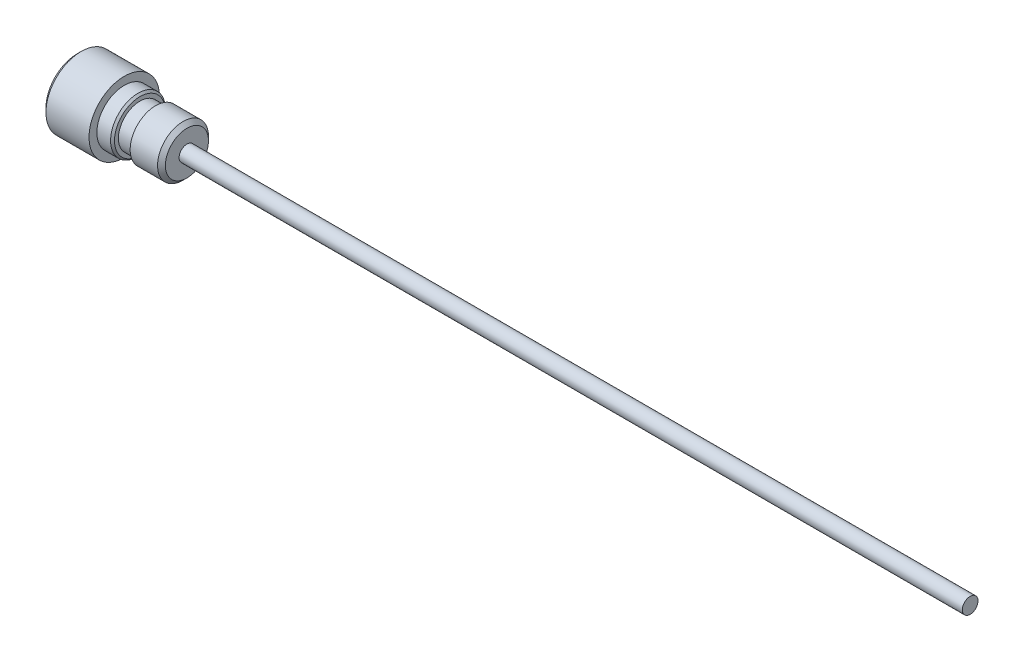
ISO-10303-21;
HEADER;
FILE_DESCRIPTION(('STEP AP214'),'2;1');
FILE_NAME('part.step','',(''),(''),'','','');
FILE_SCHEMA(('AUTOMOTIVE_DESIGN { 1 0 10303 214 1 1 1 1 }'));
ENDSEC;
DATA;
#1=APPLICATION_CONTEXT('core data for automotive mechanical design processes');
#2=APPLICATION_PROTOCOL_DEFINITION('international standard','automotive_design',2000,#1);
#3=PRODUCT_CONTEXT('',#1,'mechanical');
#4=PRODUCT('Part','Part','',(#3));
#5=PRODUCT_RELATED_PRODUCT_CATEGORY('part','',(#4));
#6=PRODUCT_DEFINITION_FORMATION('','',#4);
#7=PRODUCT_DEFINITION_CONTEXT('part definition',#1,'design');
#8=PRODUCT_DEFINITION('design','',#6,#7);
#9=PRODUCT_DEFINITION_SHAPE('','',#8);
#10=(LENGTH_UNIT() NAMED_UNIT(*) SI_UNIT(.MILLI.,.METRE.));
#11=(NAMED_UNIT(*) PLANE_ANGLE_UNIT() SI_UNIT($,.RADIAN.));
#12=(NAMED_UNIT(*) SI_UNIT($,.STERADIAN.) SOLID_ANGLE_UNIT());
#13=UNCERTAINTY_MEASURE_WITH_UNIT(LENGTH_MEASURE(1.E-05),#10,'distance_accuracy_value','');
#14=(GEOMETRIC_REPRESENTATION_CONTEXT(3) GLOBAL_UNCERTAINTY_ASSIGNED_CONTEXT((#13)) GLOBAL_UNIT_ASSIGNED_CONTEXT((#10,
#11,#12)) REPRESENTATION_CONTEXT('',''));
#15=CARTESIAN_POINT('',(0.,0.,0.));
#16=DIRECTION('',(0.,0.,1.));
#17=DIRECTION('',(1.,0.,0.));
#18=AXIS2_PLACEMENT_3D('',#15,#16,#17);
#19=CARTESIAN_POINT('',(12.,0.,0.));
#20=DIRECTION('',(-1.,0.,0.));
#21=DIRECTION('',(0.,0.,1.));
#22=AXIS2_PLACEMENT_3D('',#19,#20,#21);
#23=CYLINDRICAL_SURFACE('',#22,9.);
#24=CARTESIAN_POINT('',(1.,0.,0.));
#25=DIRECTION('',(1.,0.,0.));
#26=DIRECTION('',(0.,0.,-1.));
#27=AXIS2_PLACEMENT_3D('',#24,#25,#26);
#28=CIRCLE('',#27,9.);
#29=CARTESIAN_POINT('',(1.,0.,-9.));
#30=VERTEX_POINT('',#29);
#31=EDGE_CURVE('E58',#30,#30,#28,.T.);
#32=ORIENTED_EDGE('',*,*,#31,.T.);
#33=EDGE_LOOP('',(#32));
#34=FACE_BOUND('',#33,.T.);
#35=CARTESIAN_POINT('',(12.,0.,0.));
#36=DIRECTION('',(1.,0.,0.));
#37=DIRECTION('',(0.,0.,-1.));
#38=AXIS2_PLACEMENT_3D('',#35,#36,#37);
#39=CIRCLE('',#38,9.);
#40=CARTESIAN_POINT('',(12.,0.,-9.));
#41=VERTEX_POINT('',#40);
#42=EDGE_CURVE('E61',#41,#41,#39,.T.);
#43=ORIENTED_EDGE('',*,*,#42,.F.);
#44=EDGE_LOOP('',(#43));
#45=FACE_BOUND('',#44,.T.);
#46=ADVANCED_FACE('F30',(#34,#45),#23,.T.);
#47=CARTESIAN_POINT('',(12.,0.,0.));
#48=DIRECTION('',(1.,0.,0.));
#49=DIRECTION('',(0.,0.,-1.));
#50=AXIS2_PLACEMENT_3D('',#47,#48,#49);
#51=PLANE('',#50);
#52=CARTESIAN_POINT('',(12.,0.,0.));
#53=DIRECTION('',(1.,0.,0.));
#54=DIRECTION('',(0.,0.,-1.));
#55=AXIS2_PLACEMENT_3D('',#52,#53,#54);
#56=CIRCLE('',#55,7.);
#57=CARTESIAN_POINT('',(12.,0.,-7.));
#58=VERTEX_POINT('',#57);
#59=EDGE_CURVE('E57',#58,#58,#56,.T.);
#60=ORIENTED_EDGE('',*,*,#59,.F.);
#61=EDGE_LOOP('',(#60));
#62=FACE_BOUND('',#61,.T.);
#63=ORIENTED_EDGE('',*,*,#42,.T.);
#64=EDGE_LOOP('',(#63));
#65=FACE_BOUND('',#64,.T.);
#66=ADVANCED_FACE('F105',(#62,#65),#51,.T.);
#67=CARTESIAN_POINT('',(0.,0.,0.));
#68=DIRECTION('',(1.,0.,0.));
#69=DIRECTION('',(0.,0.,-1.));
#70=AXIS2_PLACEMENT_3D('',#67,#68,#69);
#71=PLANE('',#70);
#72=CARTESIAN_POINT('',(0.,0.,0.));
#73=DIRECTION('',(1.,0.,0.));
#74=DIRECTION('',(0.,0.,-1.));
#75=AXIS2_PLACEMENT_3D('',#72,#73,#74);
#76=CIRCLE('',#75,7.99999999999999);
#77=CARTESIAN_POINT('',(0.,0.,-7.99999999999999));
#78=VERTEX_POINT('',#77);
#79=EDGE_CURVE('E54',#78,#78,#76,.F.);
#80=ORIENTED_EDGE('',*,*,#79,.T.);
#81=EDGE_LOOP('',(#80));
#82=FACE_BOUND('',#81,.T.);
#83=ADVANCED_FACE('F111',(#82),#71,.F.);
#84=CARTESIAN_POINT('',(1.,0.,0.));
#85=DIRECTION('',(1.,0.,0.));
#86=DIRECTION('',(0.,0.,-1.));
#87=AXIS2_PLACEMENT_3D('',#84,#85,#86);
#88=CONICAL_SURFACE('',#87,9.,0.78539816339745);
#89=ORIENTED_EDGE('',*,*,#79,.F.);
#90=EDGE_LOOP('',(#89));
#91=FACE_BOUND('',#90,.T.);
#92=ORIENTED_EDGE('',*,*,#31,.F.);
#93=EDGE_LOOP('',(#92));
#94=FACE_BOUND('',#93,.T.);
#95=ADVANCED_FACE('F116',(#91,#94),#88,.T.);
#96=CARTESIAN_POINT('',(16.,0.,0.));
#97=DIRECTION('',(-1.,0.,0.));
#98=DIRECTION('',(0.,0.,1.));
#99=AXIS2_PLACEMENT_3D('',#96,#97,#98);
#100=CYLINDRICAL_SURFACE('',#99,7.);
#101=CARTESIAN_POINT('',(15.5,0.,0.));
#102=DIRECTION('',(1.,0.,0.));
#103=DIRECTION('',(0.,0.,-1.));
#104=AXIS2_PLACEMENT_3D('',#101,#102,#103);
#105=CIRCLE('',#104,7.);
#106=CARTESIAN_POINT('',(15.5,0.,-7.));
#107=VERTEX_POINT('',#106);
#108=EDGE_CURVE('E10',#107,#107,#105,.F.);
#109=ORIENTED_EDGE('',*,*,#108,.T.);
#110=EDGE_LOOP('',(#109));
#111=FACE_BOUND('',#110,.T.);
#112=ORIENTED_EDGE('',*,*,#59,.T.);
#113=EDGE_LOOP('',(#112));
#114=FACE_BOUND('',#113,.T.);
#115=ADVANCED_FACE('F118',(#111,#114),#100,.T.);
#116=CARTESIAN_POINT('',(16.,0.,0.));
#117=DIRECTION('',(1.,0.,0.));
#118=DIRECTION('',(0.,0.,-1.));
#119=AXIS2_PLACEMENT_3D('',#116,#117,#118);
#120=PLANE('',#119);
#121=CARTESIAN_POINT('',(16.,0.,0.));
#122=DIRECTION('',(1.,0.,0.));
#123=DIRECTION('',(0.,0.,-1.));
#124=AXIS2_PLACEMENT_3D('',#121,#122,#123);
#125=CIRCLE('',#124,6.49999999999998);
#126=CARTESIAN_POINT('',(16.,0.,-6.49999999999998));
#127=VERTEX_POINT('',#126);
#128=EDGE_CURVE('E37',#127,#127,#125,.T.);
#129=ORIENTED_EDGE('',*,*,#128,.T.);
#130=EDGE_LOOP('',(#129));
#131=FACE_BOUND('',#130,.T.);
#132=CARTESIAN_POINT('',(16.,0.,0.));
#133=DIRECTION('',(1.,0.,0.));
#134=DIRECTION('',(0.,0.,-1.));
#135=AXIS2_PLACEMENT_3D('',#132,#133,#134);
#136=CIRCLE('',#135,5.5);
#137=CARTESIAN_POINT('',(16.,0.,-5.5));
#138=VERTEX_POINT('',#137);
#139=EDGE_CURVE('E53',#138,#138,#136,.T.);
#140=ORIENTED_EDGE('',*,*,#139,.F.);
#141=EDGE_LOOP('',(#140));
#142=FACE_BOUND('',#141,.T.);
#143=ADVANCED_FACE('F124',(#131,#142),#120,.T.);
#144=CARTESIAN_POINT('',(20.,0.,0.));
#145=DIRECTION('',(-1.,0.,0.));
#146=DIRECTION('',(0.,0.,1.));
#147=AXIS2_PLACEMENT_3D('',#144,#145,#146);
#148=CYLINDRICAL_SURFACE('',#147,5.5);
#149=CARTESIAN_POINT('',(20.,0.,0.));
#150=DIRECTION('',(1.,0.,0.));
#151=DIRECTION('',(0.,0.,-1.));
#152=AXIS2_PLACEMENT_3D('',#149,#150,#151);
#153=CIRCLE('',#152,5.5);
#154=CARTESIAN_POINT('',(20.,0.,-5.5));
#155=VERTEX_POINT('',#154);
#156=EDGE_CURVE('E64',#155,#155,#153,.T.);
#157=ORIENTED_EDGE('',*,*,#156,.F.);
#158=EDGE_LOOP('',(#157));
#159=FACE_BOUND('',#158,.T.);
#160=ORIENTED_EDGE('',*,*,#139,.T.);
#161=EDGE_LOOP('',(#160));
#162=FACE_BOUND('',#161,.T.);
#163=ADVANCED_FACE('F144',(#159,#162),#148,.T.);
#164=CARTESIAN_POINT('',(28.,0.,0.));
#165=DIRECTION('',(-1.,0.,0.));
#166=DIRECTION('',(0.,0.,1.));
#167=AXIS2_PLACEMENT_3D('',#164,#165,#166);
#168=CYLINDRICAL_SURFACE('',#167,6.5);
#169=CARTESIAN_POINT('',(27.,0.,0.));
#170=DIRECTION('',(1.,0.,0.));
#171=DIRECTION('',(0.,0.,-1.));
#172=AXIS2_PLACEMENT_3D('',#169,#170,#171);
#173=CIRCLE('',#172,6.5);
#174=CARTESIAN_POINT('',(27.,0.,-6.5));
#175=VERTEX_POINT('',#174);
#176=EDGE_CURVE('E45',#175,#175,#173,.F.);
#177=ORIENTED_EDGE('',*,*,#176,.T.);
#178=EDGE_LOOP('',(#177));
#179=FACE_BOUND('',#178,.T.);
#180=CARTESIAN_POINT('',(20.,0.,0.));
#181=DIRECTION('',(1.,0.,0.));
#182=DIRECTION('',(0.,0.,-1.));
#183=AXIS2_PLACEMENT_3D('',#180,#181,#182);
#184=CIRCLE('',#183,6.5);
#185=CARTESIAN_POINT('',(20.,0.,-6.5));
#186=VERTEX_POINT('',#185);
#187=EDGE_CURVE('E71',#186,#186,#184,.T.);
#188=ORIENTED_EDGE('',*,*,#187,.T.);
#189=EDGE_LOOP('',(#188));
#190=FACE_BOUND('',#189,.T.);
#191=ADVANCED_FACE('F91',(#179,#190),#168,.T.);
#192=CARTESIAN_POINT('',(28.,0.,0.));
#193=DIRECTION('',(1.,0.,0.));
#194=DIRECTION('',(0.,0.,-1.));
#195=AXIS2_PLACEMENT_3D('',#192,#193,#194);
#196=PLANE('',#195);
#197=CARTESIAN_POINT('',(28.,0.,0.));
#198=DIRECTION('',(1.,0.,0.));
#199=DIRECTION('',(0.,0.,-1.));
#200=AXIS2_PLACEMENT_3D('',#197,#198,#199);
#201=CIRCLE('',#200,2.);
#202=CARTESIAN_POINT('',(28.,0.,-2.));
#203=VERTEX_POINT('',#202);
#204=EDGE_CURVE('E41',#203,#203,#201,.T.);
#205=ORIENTED_EDGE('',*,*,#204,.F.);
#206=EDGE_LOOP('',(#205));
#207=FACE_BOUND('',#206,.T.);
#208=CARTESIAN_POINT('',(28.,0.,0.));
#209=DIRECTION('',(1.,0.,0.));
#210=DIRECTION('',(0.,0.,-1.));
#211=AXIS2_PLACEMENT_3D('',#208,#209,#210);
#212=CIRCLE('',#211,5.5);
#213=CARTESIAN_POINT('',(28.,0.,-5.5));
#214=VERTEX_POINT('',#213);
#215=EDGE_CURVE('E50',#214,#214,#212,.T.);
#216=ORIENTED_EDGE('',*,*,#215,.T.);
#217=EDGE_LOOP('',(#216));
#218=FACE_BOUND('',#217,.T.);
#219=ADVANCED_FACE('F87',(#207,#218),#196,.T.);
#220=CARTESIAN_POINT('',(20.,0.,0.));
#221=DIRECTION('',(1.,0.,0.));
#222=DIRECTION('',(0.,0.,-1.));
#223=AXIS2_PLACEMENT_3D('',#220,#221,#222);
#224=PLANE('',#223);
#225=ORIENTED_EDGE('',*,*,#156,.T.);
#226=EDGE_LOOP('',(#225));
#227=FACE_BOUND('',#226,.T.);
#228=ORIENTED_EDGE('',*,*,#187,.F.);
#229=EDGE_LOOP('',(#228));
#230=FACE_BOUND('',#229,.T.);
#231=ADVANCED_FACE('F90',(#227,#230),#224,.F.);
#232=CARTESIAN_POINT('',(28.,0.,0.));
#233=DIRECTION('',(-1.,0.,0.));
#234=DIRECTION('',(0.,0.,1.));
#235=AXIS2_PLACEMENT_3D('',#232,#233,#234);
#236=CONICAL_SURFACE('',#235,5.5,0.785398163397446);
#237=ORIENTED_EDGE('',*,*,#176,.F.);
#238=EDGE_LOOP('',(#237));
#239=FACE_BOUND('',#238,.T.);
#240=ORIENTED_EDGE('',*,*,#215,.F.);
#241=EDGE_LOOP('',(#240));
#242=FACE_BOUND('',#241,.T.);
#243=ADVANCED_FACE('F83',(#239,#242),#236,.T.);
#244=CARTESIAN_POINT('',(228.,0.,0.));
#245=DIRECTION('',(-1.,0.,0.));
#246=DIRECTION('',(0.,0.,1.));
#247=AXIS2_PLACEMENT_3D('',#244,#245,#246);
#248=CYLINDRICAL_SURFACE('',#247,2.);
#249=CARTESIAN_POINT('',(228.,0.,0.));
#250=DIRECTION('',(1.,0.,0.));
#251=DIRECTION('',(0.,0.,-1.));
#252=AXIS2_PLACEMENT_3D('',#249,#250,#251);
#253=CIRCLE('',#252,2.);
#254=CARTESIAN_POINT('',(228.,0.,-2.));
#255=VERTEX_POINT('',#254);
#256=EDGE_CURVE('E73',#255,#255,#253,.T.);
#257=ORIENTED_EDGE('',*,*,#256,.F.);
#258=EDGE_LOOP('',(#257));
#259=FACE_BOUND('',#258,.T.);
#260=ORIENTED_EDGE('',*,*,#204,.T.);
#261=EDGE_LOOP('',(#260));
#262=FACE_BOUND('',#261,.T.);
#263=ADVANCED_FACE('F80',(#259,#262),#248,.T.);
#264=CARTESIAN_POINT('',(228.,0.,0.));
#265=DIRECTION('',(1.,0.,0.));
#266=DIRECTION('',(0.,0.,-1.));
#267=AXIS2_PLACEMENT_3D('',#264,#265,#266);
#268=PLANE('',#267);
#269=ORIENTED_EDGE('',*,*,#256,.T.);
#270=EDGE_LOOP('',(#269));
#271=FACE_BOUND('',#270,.T.);
#272=ADVANCED_FACE('F78',(#271),#268,.T.);
#273=CARTESIAN_POINT('',(16.,0.,0.));
#274=DIRECTION('',(-1.,0.,0.));
#275=DIRECTION('',(0.,0.,1.));
#276=AXIS2_PLACEMENT_3D('',#273,#274,#275);
#277=CONICAL_SURFACE('',#276,6.49999999999998,0.785398163397453);
#278=ORIENTED_EDGE('',*,*,#108,.F.);
#279=EDGE_LOOP('',(#278));
#280=FACE_BOUND('',#279,.T.);
#281=ORIENTED_EDGE('',*,*,#128,.F.);
#282=EDGE_LOOP('',(#281));
#283=FACE_BOUND('',#282,.T.);
#284=ADVANCED_FACE('F32',(#280,#283),#277,.T.);
#285=CLOSED_SHELL('',(#46,#66,#83,#95,#115,#143,#163,#191,#219,#231,#243,#263,#272,#284));
#286=MANIFOLD_SOLID_BREP('B2',#285);
#287=ADVANCED_BREP_SHAPE_REPRESENTATION('',(#18,#286),#14);
#288=SHAPE_DEFINITION_REPRESENTATION(#9,#287);
ENDSEC;
END-ISO-10303-21;
